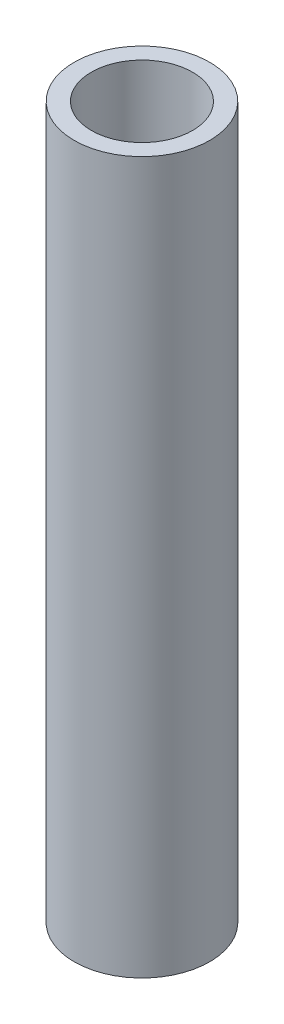
ISO-10303-21;
HEADER;
FILE_DESCRIPTION(('STEP AP214'),'2;1');
FILE_NAME('part.step','',(''),(''),'','','');
FILE_SCHEMA(('AUTOMOTIVE_DESIGN { 1 0 10303 214 1 1 1 1 }'));
ENDSEC;
DATA;
#1=APPLICATION_CONTEXT('core data for automotive mechanical design processes');
#2=APPLICATION_PROTOCOL_DEFINITION('international standard','automotive_design',2000,#1);
#3=PRODUCT_CONTEXT('',#1,'mechanical');
#4=PRODUCT('Part','Part','',(#3));
#5=PRODUCT_RELATED_PRODUCT_CATEGORY('part','',(#4));
#6=PRODUCT_DEFINITION_FORMATION('','',#4);
#7=PRODUCT_DEFINITION_CONTEXT('part definition',#1,'design');
#8=PRODUCT_DEFINITION('design','',#6,#7);
#9=PRODUCT_DEFINITION_SHAPE('','',#8);
#10=(LENGTH_UNIT() NAMED_UNIT(*) SI_UNIT(.MILLI.,.METRE.));
#11=(NAMED_UNIT(*) PLANE_ANGLE_UNIT() SI_UNIT($,.RADIAN.));
#12=(NAMED_UNIT(*) SI_UNIT($,.STERADIAN.) SOLID_ANGLE_UNIT());
#13=UNCERTAINTY_MEASURE_WITH_UNIT(LENGTH_MEASURE(1.E-05),#10,'distance_accuracy_value','');
#14=(GEOMETRIC_REPRESENTATION_CONTEXT(3) GLOBAL_UNCERTAINTY_ASSIGNED_CONTEXT((#13)) GLOBAL_UNIT_ASSIGNED_CONTEXT((#10,
#11,#12)) REPRESENTATION_CONTEXT('',''));
#15=CARTESIAN_POINT('',(0.,0.,0.));
#16=DIRECTION('',(0.,0.,1.));
#17=DIRECTION('',(1.,0.,0.));
#18=AXIS2_PLACEMENT_3D('',#15,#16,#17);
#19=CARTESIAN_POINT('',(0.,100.,0.));
#20=DIRECTION('',(0.,1.,0.));
#21=DIRECTION('',(0.,0.,1.));
#22=AXIS2_PLACEMENT_3D('',#19,#20,#21);
#23=PLANE('',#22);
#24=CARTESIAN_POINT('',(0.,100.,0.));
#25=DIRECTION('',(0.,1.,0.));
#26=DIRECTION('',(0.,0.,1.));
#27=AXIS2_PLACEMENT_3D('',#24,#25,#26);
#28=CIRCLE('',#27,9.525);
#29=CARTESIAN_POINT('',(0.,100.,9.525));
#30=VERTEX_POINT('',#29);
#31=EDGE_CURVE('E10',#30,#30,#28,.T.);
#32=ORIENTED_EDGE('',*,*,#31,.T.);
#33=EDGE_LOOP('',(#32));
#34=FACE_BOUND('',#33,.T.);
#35=CARTESIAN_POINT('',(0.,100.,0.));
#36=DIRECTION('',(0.,1.,0.));
#37=DIRECTION('',(0.,0.,1.));
#38=AXIS2_PLACEMENT_3D('',#35,#36,#37);
#39=CIRCLE('',#38,7.112);
#40=CARTESIAN_POINT('',(0.,100.,7.112));
#41=VERTEX_POINT('',#40);
#42=EDGE_CURVE('E43',#41,#41,#39,.T.);
#43=ORIENTED_EDGE('',*,*,#42,.F.);
#44=EDGE_LOOP('',(#43));
#45=FACE_BOUND('',#44,.T.);
#46=ADVANCED_FACE('F32',(#34,#45),#23,.T.);
#47=CARTESIAN_POINT('',(0.,0.,0.));
#48=DIRECTION('',(0.,1.,0.));
#49=DIRECTION('',(0.,0.,1.));
#50=AXIS2_PLACEMENT_3D('',#47,#48,#49);
#51=PLANE('',#50);
#52=CARTESIAN_POINT('',(0.,0.,0.));
#53=DIRECTION('',(0.,1.,0.));
#54=DIRECTION('',(0.,0.,1.));
#55=AXIS2_PLACEMENT_3D('',#52,#53,#54);
#56=CIRCLE('',#55,9.525);
#57=CARTESIAN_POINT('',(0.,0.,9.525));
#58=VERTEX_POINT('',#57);
#59=EDGE_CURVE('E36',#58,#58,#56,.T.);
#60=ORIENTED_EDGE('',*,*,#59,.F.);
#61=EDGE_LOOP('',(#60));
#62=FACE_BOUND('',#61,.T.);
#63=CARTESIAN_POINT('',(0.,0.,0.));
#64=DIRECTION('',(0.,1.,0.));
#65=DIRECTION('',(0.,0.,1.));
#66=AXIS2_PLACEMENT_3D('',#63,#64,#65);
#67=CIRCLE('',#66,7.112);
#68=CARTESIAN_POINT('',(0.,0.,7.112));
#69=VERTEX_POINT('',#68);
#70=EDGE_CURVE('E45',#69,#69,#67,.T.);
#71=ORIENTED_EDGE('',*,*,#70,.T.);
#72=EDGE_LOOP('',(#71));
#73=FACE_BOUND('',#72,.T.);
#74=ADVANCED_FACE('F55',(#62,#73),#51,.F.);
#75=CARTESIAN_POINT('',(0.,100.,0.));
#76=DIRECTION('',(0.,-1.,0.));
#77=DIRECTION('',(0.,0.,-1.));
#78=AXIS2_PLACEMENT_3D('',#75,#76,#77);
#79=CYLINDRICAL_SURFACE('',#78,9.525);
#80=ORIENTED_EDGE('',*,*,#31,.F.);
#81=EDGE_LOOP('',(#80));
#82=FACE_BOUND('',#81,.T.);
#83=ORIENTED_EDGE('',*,*,#59,.T.);
#84=EDGE_LOOP('',(#83));
#85=FACE_BOUND('',#84,.T.);
#86=ADVANCED_FACE('F34',(#82,#85),#79,.T.);
#87=CARTESIAN_POINT('',(0.,100.,0.));
#88=DIRECTION('',(0.,-1.,0.));
#89=DIRECTION('',(0.,0.,-1.));
#90=AXIS2_PLACEMENT_3D('',#87,#88,#89);
#91=CYLINDRICAL_SURFACE('',#90,7.112);
#92=ORIENTED_EDGE('',*,*,#42,.T.);
#93=EDGE_LOOP('',(#92));
#94=FACE_BOUND('',#93,.T.);
#95=ORIENTED_EDGE('',*,*,#70,.F.);
#96=EDGE_LOOP('',(#95));
#97=FACE_BOUND('',#96,.T.);
#98=ADVANCED_FACE('F51',(#94,#97),#91,.F.);
#99=CLOSED_SHELL('',(#46,#74,#86,#98));
#100=MANIFOLD_SOLID_BREP('B2',#99);
#101=ADVANCED_BREP_SHAPE_REPRESENTATION('',(#18,#100),#14);
#102=SHAPE_DEFINITION_REPRESENTATION(#9,#101);
ENDSEC;
END-ISO-10303-21;
